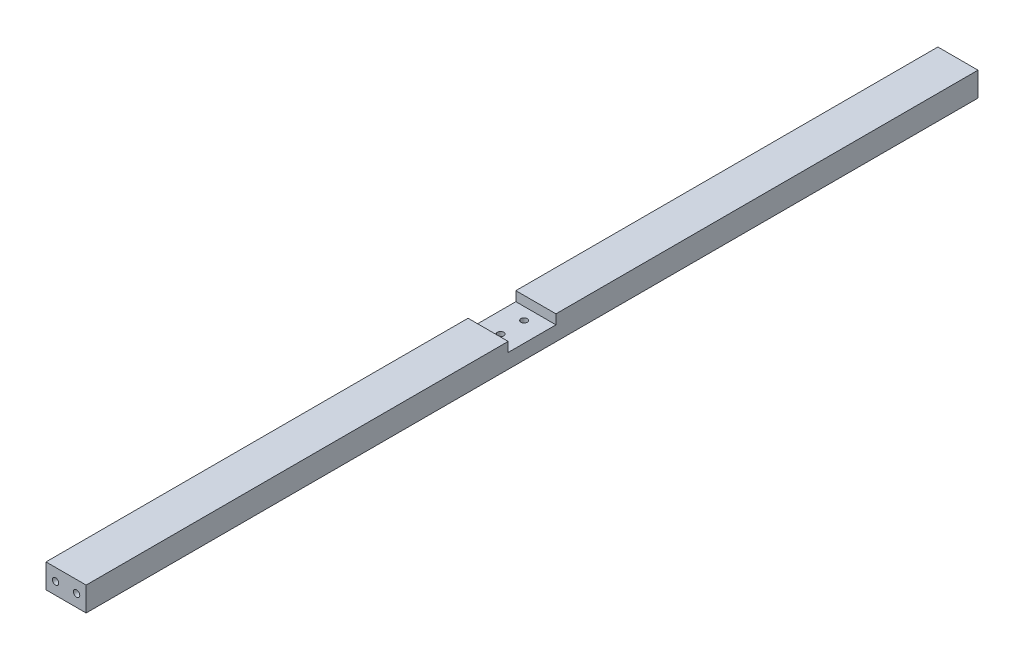
ISO-10303-21;
HEADER;
FILE_DESCRIPTION(('STEP AP214'),'2;1');
FILE_NAME('part.step','',(''),(''),'','','');
FILE_SCHEMA(('AUTOMOTIVE_DESIGN { 1 0 10303 214 1 1 1 1 }'));
ENDSEC;
DATA;
#1=APPLICATION_CONTEXT('core data for automotive mechanical design processes');
#2=APPLICATION_PROTOCOL_DEFINITION('international standard','automotive_design',2000,#1);
#3=PRODUCT_CONTEXT('',#1,'mechanical');
#4=PRODUCT('Part','Part','',(#3));
#5=PRODUCT_RELATED_PRODUCT_CATEGORY('part','',(#4));
#6=PRODUCT_DEFINITION_FORMATION('','',#4);
#7=PRODUCT_DEFINITION_CONTEXT('part definition',#1,'design');
#8=PRODUCT_DEFINITION('design','',#6,#7);
#9=PRODUCT_DEFINITION_SHAPE('','',#8);
#10=(LENGTH_UNIT() NAMED_UNIT(*) SI_UNIT(.MILLI.,.METRE.));
#11=(NAMED_UNIT(*) PLANE_ANGLE_UNIT() SI_UNIT($,.RADIAN.));
#12=(NAMED_UNIT(*) SI_UNIT($,.STERADIAN.) SOLID_ANGLE_UNIT());
#13=UNCERTAINTY_MEASURE_WITH_UNIT(LENGTH_MEASURE(1.E-05),#10,'distance_accuracy_value','');
#14=(GEOMETRIC_REPRESENTATION_CONTEXT(3) GLOBAL_UNCERTAINTY_ASSIGNED_CONTEXT((#13)) GLOBAL_UNIT_ASSIGNED_CONTEXT((#10,
#11,#12)) REPRESENTATION_CONTEXT('',''));
#15=CARTESIAN_POINT('',(0.,0.,0.));
#16=DIRECTION('',(0.,0.,1.));
#17=DIRECTION('',(1.,0.,0.));
#18=AXIS2_PLACEMENT_3D('',#15,#16,#17);
#19=CARTESIAN_POINT('',(0.,38.,1400.));
#20=DIRECTION('',(0.,-1.,0.));
#21=DIRECTION('',(0.,0.,-1.));
#22=AXIS2_PLACEMENT_3D('',#19,#20,#21);
#23=PLANE('',#22);
#24=DIRECTION('',(0.,0.,-1.));
#25=VECTOR('',#24,1.);
#26=CARTESIAN_POINT('',(0.,38.,1400.));
#27=LINE('',#26,#25);
#28=CARTESIAN_POINT('',(0.,38.,662.5));
#29=VERTEX_POINT('',#28);
#30=CARTESIAN_POINT('',(0.,38.,0.));
#31=VERTEX_POINT('',#30);
#32=EDGE_CURVE('E79',#29,#31,#27,.T.);
#33=ORIENTED_EDGE('',*,*,#32,.F.);
#34=DIRECTION('',(-1.,0.,0.));
#35=VECTOR('',#34,1.);
#36=CARTESIAN_POINT('',(0.,38.,662.5));
#37=LINE('',#36,#35);
#38=CARTESIAN_POINT('',(63.,38.,662.5));
#39=VERTEX_POINT('',#38);
#40=EDGE_CURVE('E112',#39,#29,#37,.T.);
#41=ORIENTED_EDGE('',*,*,#40,.F.);
#42=DIRECTION('',(0.,0.,-1.));
#43=VECTOR('',#42,1.);
#44=CARTESIAN_POINT('',(63.,38.,1400.));
#45=LINE('',#44,#43);
#46=CARTESIAN_POINT('',(63.,38.,0.));
#47=VERTEX_POINT('',#46);
#48=EDGE_CURVE('E182',#39,#47,#45,.T.);
#49=ORIENTED_EDGE('',*,*,#48,.T.);
#50=DIRECTION('',(-1.,0.,0.));
#51=VECTOR('',#50,1.);
#52=CARTESIAN_POINT('',(0.,38.,0.));
#53=LINE('',#52,#51);
#54=EDGE_CURVE('E168',#47,#31,#53,.T.);
#55=ORIENTED_EDGE('',*,*,#54,.T.);
#56=EDGE_LOOP('',(#33,#41,#49,#55));
#57=FACE_BOUND('',#56,.T.);
#58=ADVANCED_FACE('F33',(#57),#23,.F.);
#59=CARTESIAN_POINT('',(0.,0.,1400.));
#60=DIRECTION('',(1.,0.,0.));
#61=DIRECTION('',(0.,0.,-1.));
#62=AXIS2_PLACEMENT_3D('',#59,#60,#61);
#63=PLANE('',#62);
#64=DIRECTION('',(0.,0.,1.));
#65=VECTOR('',#64,1.);
#66=CARTESIAN_POINT('',(0.,23.,662.5));
#67=LINE('',#66,#65);
#68=CARTESIAN_POINT('',(0.,23.,662.5));
#69=VERTEX_POINT('',#68);
#70=CARTESIAN_POINT('',(0.,23.,737.5));
#71=VERTEX_POINT('',#70);
#72=EDGE_CURVE('E120',#69,#71,#67,.T.);
#73=ORIENTED_EDGE('',*,*,#72,.F.);
#74=DIRECTION('',(0.,1.,0.));
#75=VECTOR('',#74,1.);
#76=CARTESIAN_POINT('',(0.,23.,662.5));
#77=LINE('',#76,#75);
#78=EDGE_CURVE('E106',#69,#29,#77,.T.);
#79=ORIENTED_EDGE('',*,*,#78,.T.);
#80=ORIENTED_EDGE('',*,*,#32,.T.);
#81=DIRECTION('',(0.,-1.,0.));
#82=VECTOR('',#81,1.);
#83=CARTESIAN_POINT('',(0.,0.,0.));
#84=LINE('',#83,#82);
#85=CARTESIAN_POINT('',(0.,0.,0.));
#86=VERTEX_POINT('',#85);
#87=EDGE_CURVE('E163',#31,#86,#84,.T.);
#88=ORIENTED_EDGE('',*,*,#87,.T.);
#89=DIRECTION('',(0.,0.,-1.));
#90=VECTOR('',#89,1.);
#91=CARTESIAN_POINT('',(0.,0.,1400.));
#92=LINE('',#91,#90);
#93=CARTESIAN_POINT('',(0.,0.,1400.));
#94=VERTEX_POINT('',#93);
#95=EDGE_CURVE('E11',#94,#86,#92,.T.);
#96=ORIENTED_EDGE('',*,*,#95,.F.);
#97=DIRECTION('',(0.,-1.,0.));
#98=VECTOR('',#97,1.);
#99=CARTESIAN_POINT('',(0.,0.,1400.));
#100=LINE('',#99,#98);
#101=CARTESIAN_POINT('',(0.,38.,1400.));
#102=VERTEX_POINT('',#101);
#103=EDGE_CURVE('E166',#102,#94,#100,.T.);
#104=ORIENTED_EDGE('',*,*,#103,.F.);
#105=CARTESIAN_POINT('',(0.,38.,737.5));
#106=VERTEX_POINT('',#105);
#107=EDGE_CURVE('E180',#102,#106,#27,.T.);
#108=ORIENTED_EDGE('',*,*,#107,.T.);
#109=DIRECTION('',(0.,1.,0.));
#110=VECTOR('',#109,1.);
#111=CARTESIAN_POINT('',(0.,23.,737.5));
#112=LINE('',#111,#110);
#113=EDGE_CURVE('E48',#71,#106,#112,.T.);
#114=ORIENTED_EDGE('',*,*,#113,.F.);
#115=EDGE_LOOP('',(#73,#79,#80,#88,#96,#104,#108,#114));
#116=FACE_BOUND('',#115,.T.);
#117=ADVANCED_FACE('F35',(#116),#63,.F.);
#118=CARTESIAN_POINT('',(0.,0.,1400.));
#119=DIRECTION('',(0.,1.,0.));
#120=DIRECTION('',(0.,0.,1.));
#121=AXIS2_PLACEMENT_3D('',#118,#119,#120);
#122=PLANE('',#121);
#123=CARTESIAN_POINT('',(32.,0.,681.5));
#124=DIRECTION('',(0.,1.,0.));
#125=DIRECTION('',(0.,0.,-1.));
#126=AXIS2_PLACEMENT_3D('',#123,#124,#125);
#127=CIRCLE('',#126,5.);
#128=CARTESIAN_POINT('',(32.,0.,676.5));
#129=VERTEX_POINT('',#128);
#130=EDGE_CURVE('E230',#129,#129,#127,.T.);
#131=ORIENTED_EDGE('',*,*,#130,.T.);
#132=EDGE_LOOP('',(#131));
#133=FACE_BOUND('',#132,.T.);
#134=CARTESIAN_POINT('',(32.,0.,718.5));
#135=DIRECTION('',(0.,1.,0.));
#136=DIRECTION('',(0.,0.,1.));
#137=AXIS2_PLACEMENT_3D('',#134,#135,#136);
#138=CIRCLE('',#137,5.);
#139=CARTESIAN_POINT('',(32.,0.,723.5));
#140=VERTEX_POINT('',#139);
#141=EDGE_CURVE('E133',#140,#140,#138,.T.);
#142=ORIENTED_EDGE('',*,*,#141,.T.);
#143=EDGE_LOOP('',(#142));
#144=FACE_BOUND('',#143,.T.);
#145=DIRECTION('',(1.,0.,0.));
#146=VECTOR('',#145,1.);
#147=CARTESIAN_POINT('',(0.,0.,0.));
#148=LINE('',#147,#146);
#149=CARTESIAN_POINT('',(63.,0.,0.));
#150=VERTEX_POINT('',#149);
#151=EDGE_CURVE('E174',#86,#150,#148,.T.);
#152=ORIENTED_EDGE('',*,*,#151,.T.);
#153=DIRECTION('',(0.,0.,-1.));
#154=VECTOR('',#153,1.);
#155=CARTESIAN_POINT('',(63.,0.,1400.));
#156=LINE('',#155,#154);
#157=CARTESIAN_POINT('',(63.,0.,1400.));
#158=VERTEX_POINT('',#157);
#159=EDGE_CURVE('E41',#158,#150,#156,.T.);
#160=ORIENTED_EDGE('',*,*,#159,.F.);
#161=DIRECTION('',(1.,0.,0.));
#162=VECTOR('',#161,1.);
#163=CARTESIAN_POINT('',(0.,0.,1400.));
#164=LINE('',#163,#162);
#165=EDGE_CURVE('E86',#94,#158,#164,.T.);
#166=ORIENTED_EDGE('',*,*,#165,.F.);
#167=ORIENTED_EDGE('',*,*,#95,.T.);
#168=EDGE_LOOP('',(#152,#160,#166,#167));
#169=FACE_BOUND('',#168,.T.);
#170=ADVANCED_FACE('F220',(#133,#144,#169),#122,.F.);
#171=CARTESIAN_POINT('',(63.,0.,1400.));
#172=DIRECTION('',(-1.,0.,0.));
#173=DIRECTION('',(0.,0.,1.));
#174=AXIS2_PLACEMENT_3D('',#171,#172,#173);
#175=PLANE('',#174);
#176=ORIENTED_EDGE('',*,*,#48,.F.);
#177=DIRECTION('',(0.,1.,0.));
#178=VECTOR('',#177,1.);
#179=CARTESIAN_POINT('',(63.,23.,662.5));
#180=LINE('',#179,#178);
#181=CARTESIAN_POINT('',(63.,23.,662.5));
#182=VERTEX_POINT('',#181);
#183=EDGE_CURVE('E135',#182,#39,#180,.T.);
#184=ORIENTED_EDGE('',*,*,#183,.F.);
#185=DIRECTION('',(0.,0.,-1.));
#186=VECTOR('',#185,1.);
#187=CARTESIAN_POINT('',(63.,23.,737.5));
#188=LINE('',#187,#186);
#189=CARTESIAN_POINT('',(63.,23.,737.5));
#190=VERTEX_POINT('',#189);
#191=EDGE_CURVE('E114',#190,#182,#188,.T.);
#192=ORIENTED_EDGE('',*,*,#191,.F.);
#193=DIRECTION('',(0.,1.,0.));
#194=VECTOR('',#193,1.);
#195=CARTESIAN_POINT('',(63.,23.,737.5));
#196=LINE('',#195,#194);
#197=CARTESIAN_POINT('',(63.,38.,737.5));
#198=VERTEX_POINT('',#197);
#199=EDGE_CURVE('E138',#190,#198,#196,.T.);
#200=ORIENTED_EDGE('',*,*,#199,.T.);
#201=CARTESIAN_POINT('',(63.,38.,1400.));
#202=VERTEX_POINT('',#201);
#203=EDGE_CURVE('E183',#202,#198,#45,.T.);
#204=ORIENTED_EDGE('',*,*,#203,.F.);
#205=DIRECTION('',(0.,1.,0.));
#206=VECTOR('',#205,1.);
#207=CARTESIAN_POINT('',(63.,0.,1400.));
#208=LINE('',#207,#206);
#209=EDGE_CURVE('E170',#158,#202,#208,.T.);
#210=ORIENTED_EDGE('',*,*,#209,.F.);
#211=ORIENTED_EDGE('',*,*,#159,.T.);
#212=DIRECTION('',(0.,1.,0.));
#213=VECTOR('',#212,1.);
#214=CARTESIAN_POINT('',(63.,0.,0.));
#215=LINE('',#214,#213);
#216=EDGE_CURVE('E176',#150,#47,#215,.T.);
#217=ORIENTED_EDGE('',*,*,#216,.T.);
#218=EDGE_LOOP('',(#176,#184,#192,#200,#204,#210,#211,#217));
#219=FACE_BOUND('',#218,.T.);
#220=ADVANCED_FACE('F190',(#219),#175,.F.);
#221=ORIENTED_EDGE('',*,*,#203,.T.);
#222=DIRECTION('',(1.,0.,0.));
#223=VECTOR('',#222,1.);
#224=CARTESIAN_POINT('',(0.,38.,737.5));
#225=LINE('',#224,#223);
#226=EDGE_CURVE('E123',#106,#198,#225,.T.);
#227=ORIENTED_EDGE('',*,*,#226,.F.);
#228=ORIENTED_EDGE('',*,*,#107,.F.);
#229=DIRECTION('',(-1.,0.,0.));
#230=VECTOR('',#229,1.);
#231=CARTESIAN_POINT('',(0.,38.,1400.));
#232=LINE('',#231,#230);
#233=EDGE_CURVE('E57',#202,#102,#232,.T.);
#234=ORIENTED_EDGE('',*,*,#233,.F.);
#235=EDGE_LOOP('',(#221,#227,#228,#234));
#236=FACE_BOUND('',#235,.T.);
#237=ADVANCED_FACE('F198',(#236),#23,.F.);
#238=CARTESIAN_POINT('',(0.,0.,1400.));
#239=DIRECTION('',(0.,0.,-1.));
#240=DIRECTION('',(-1.,0.,0.));
#241=AXIS2_PLACEMENT_3D('',#238,#239,#240);
#242=PLANE('',#241);
#243=CARTESIAN_POINT('',(48.,19.,1400.));
#244=DIRECTION('',(0.,0.,1.));
#245=DIRECTION('',(-1.,0.,0.));
#246=AXIS2_PLACEMENT_3D('',#243,#244,#245);
#247=CIRCLE('',#246,5.);
#248=CARTESIAN_POINT('',(43.,19.,1400.));
#249=VERTEX_POINT('',#248);
#250=EDGE_CURVE('E151',#249,#249,#247,.T.);
#251=ORIENTED_EDGE('',*,*,#250,.F.);
#252=EDGE_LOOP('',(#251));
#253=FACE_BOUND('',#252,.T.);
#254=CARTESIAN_POINT('',(15.,19.,1400.));
#255=DIRECTION('',(0.,0.,1.));
#256=DIRECTION('',(1.,0.,0.));
#257=AXIS2_PLACEMENT_3D('',#254,#255,#256);
#258=CIRCLE('',#257,5.);
#259=CARTESIAN_POINT('',(20.,19.,1400.));
#260=VERTEX_POINT('',#259);
#261=EDGE_CURVE('E157',#260,#260,#258,.T.);
#262=ORIENTED_EDGE('',*,*,#261,.F.);
#263=EDGE_LOOP('',(#262));
#264=FACE_BOUND('',#263,.T.);
#265=ORIENTED_EDGE('',*,*,#103,.T.);
#266=ORIENTED_EDGE('',*,*,#165,.T.);
#267=ORIENTED_EDGE('',*,*,#209,.T.);
#268=ORIENTED_EDGE('',*,*,#233,.T.);
#269=EDGE_LOOP('',(#265,#266,#267,#268));
#270=FACE_BOUND('',#269,.T.);
#271=ADVANCED_FACE('F201',(#253,#264,#270),#242,.F.);
#272=CARTESIAN_POINT('',(0.,0.,0.));
#273=DIRECTION('',(0.,0.,-1.));
#274=DIRECTION('',(-1.,0.,0.));
#275=AXIS2_PLACEMENT_3D('',#272,#273,#274);
#276=PLANE('',#275);
#277=CARTESIAN_POINT('',(48.,19.,0.));
#278=DIRECTION('',(0.,0.,1.));
#279=DIRECTION('',(-1.,0.,0.));
#280=AXIS2_PLACEMENT_3D('',#277,#278,#279);
#281=CIRCLE('',#280,5.);
#282=CARTESIAN_POINT('',(43.,19.,0.));
#283=VERTEX_POINT('',#282);
#284=EDGE_CURVE('E137',#283,#283,#281,.T.);
#285=ORIENTED_EDGE('',*,*,#284,.T.);
#286=EDGE_LOOP('',(#285));
#287=FACE_BOUND('',#286,.T.);
#288=CARTESIAN_POINT('',(15.,19.,0.));
#289=DIRECTION('',(0.,0.,1.));
#290=DIRECTION('',(1.,0.,0.));
#291=AXIS2_PLACEMENT_3D('',#288,#289,#290);
#292=CIRCLE('',#291,5.);
#293=CARTESIAN_POINT('',(20.,19.,0.));
#294=VERTEX_POINT('',#293);
#295=EDGE_CURVE('E145',#294,#294,#292,.T.);
#296=ORIENTED_EDGE('',*,*,#295,.T.);
#297=EDGE_LOOP('',(#296));
#298=FACE_BOUND('',#297,.T.);
#299=ORIENTED_EDGE('',*,*,#87,.F.);
#300=ORIENTED_EDGE('',*,*,#54,.F.);
#301=ORIENTED_EDGE('',*,*,#216,.F.);
#302=ORIENTED_EDGE('',*,*,#151,.F.);
#303=EDGE_LOOP('',(#299,#300,#301,#302));
#304=FACE_BOUND('',#303,.T.);
#305=ADVANCED_FACE('F195',(#287,#298,#304),#276,.T.);
#306=CARTESIAN_POINT('',(15.,19.,1350.));
#307=DIRECTION('',(0.,0.,1.));
#308=DIRECTION('',(1.,0.,0.));
#309=AXIS2_PLACEMENT_3D('',#306,#307,#308);
#310=CYLINDRICAL_SURFACE('',#309,5.);
#311=CARTESIAN_POINT('',(15.,19.,1350.));
#312=DIRECTION('',(0.,0.,1.));
#313=DIRECTION('',(1.,0.,0.));
#314=AXIS2_PLACEMENT_3D('',#311,#312,#313);
#315=CIRCLE('',#314,5.);
#316=CARTESIAN_POINT('',(20.,19.,1350.));
#317=VERTEX_POINT('',#316);
#318=EDGE_CURVE('E160',#317,#317,#315,.T.);
#319=ORIENTED_EDGE('',*,*,#318,.F.);
#320=EDGE_LOOP('',(#319));
#321=FACE_BOUND('',#320,.T.);
#322=ORIENTED_EDGE('',*,*,#261,.T.);
#323=EDGE_LOOP('',(#322));
#324=FACE_BOUND('',#323,.T.);
#325=ADVANCED_FACE('F209',(#321,#324),#310,.F.);
#326=CARTESIAN_POINT('',(15.,19.,1350.));
#327=DIRECTION('',(0.,0.,1.));
#328=DIRECTION('',(1.,0.,0.));
#329=AXIS2_PLACEMENT_3D('',#326,#327,#328);
#330=PLANE('',#329);
#331=ORIENTED_EDGE('',*,*,#318,.T.);
#332=EDGE_LOOP('',(#331));
#333=FACE_BOUND('',#332,.T.);
#334=ADVANCED_FACE('F287',(#333),#330,.T.);
#335=CARTESIAN_POINT('',(48.,19.,1350.));
#336=DIRECTION('',(0.,0.,1.));
#337=DIRECTION('',(1.,0.,0.));
#338=AXIS2_PLACEMENT_3D('',#335,#336,#337);
#339=CYLINDRICAL_SURFACE('',#338,5.);
#340=CARTESIAN_POINT('',(48.,19.,1350.));
#341=DIRECTION('',(0.,0.,1.));
#342=DIRECTION('',(-1.,0.,0.));
#343=AXIS2_PLACEMENT_3D('',#340,#341,#342);
#344=CIRCLE('',#343,5.);
#345=CARTESIAN_POINT('',(43.,19.,1350.));
#346=VERTEX_POINT('',#345);
#347=EDGE_CURVE('E154',#346,#346,#344,.T.);
#348=ORIENTED_EDGE('',*,*,#347,.F.);
#349=EDGE_LOOP('',(#348));
#350=FACE_BOUND('',#349,.T.);
#351=ORIENTED_EDGE('',*,*,#250,.T.);
#352=EDGE_LOOP('',(#351));
#353=FACE_BOUND('',#352,.T.);
#354=ADVANCED_FACE('F283',(#350,#353),#339,.F.);
#355=CARTESIAN_POINT('',(48.,19.,1350.));
#356=DIRECTION('',(0.,0.,-1.));
#357=DIRECTION('',(-1.,0.,0.));
#358=AXIS2_PLACEMENT_3D('',#355,#356,#357);
#359=PLANE('',#358);
#360=ORIENTED_EDGE('',*,*,#347,.T.);
#361=EDGE_LOOP('',(#360));
#362=FACE_BOUND('',#361,.T.);
#363=ADVANCED_FACE('F279',(#362),#359,.F.);
#364=CARTESIAN_POINT('',(15.,19.,50.));
#365=DIRECTION('',(0.,0.,-1.));
#366=DIRECTION('',(-1.,0.,0.));
#367=AXIS2_PLACEMENT_3D('',#364,#365,#366);
#368=CYLINDRICAL_SURFACE('',#367,5.);
#369=CARTESIAN_POINT('',(15.,19.,50.));
#370=DIRECTION('',(0.,0.,1.));
#371=DIRECTION('',(1.,0.,0.));
#372=AXIS2_PLACEMENT_3D('',#369,#370,#371);
#373=CIRCLE('',#372,5.);
#374=CARTESIAN_POINT('',(20.,19.,50.));
#375=VERTEX_POINT('',#374);
#376=EDGE_CURVE('E148',#375,#375,#373,.T.);
#377=ORIENTED_EDGE('',*,*,#376,.T.);
#378=EDGE_LOOP('',(#377));
#379=FACE_BOUND('',#378,.T.);
#380=ORIENTED_EDGE('',*,*,#295,.F.);
#381=EDGE_LOOP('',(#380));
#382=FACE_BOUND('',#381,.T.);
#383=ADVANCED_FACE('F275',(#379,#382),#368,.F.);
#384=CARTESIAN_POINT('',(15.,19.,50.));
#385=DIRECTION('',(0.,0.,1.));
#386=DIRECTION('',(1.,0.,0.));
#387=AXIS2_PLACEMENT_3D('',#384,#385,#386);
#388=PLANE('',#387);
#389=ORIENTED_EDGE('',*,*,#376,.F.);
#390=EDGE_LOOP('',(#389));
#391=FACE_BOUND('',#390,.T.);
#392=ADVANCED_FACE('F271',(#391),#388,.F.);
#393=CARTESIAN_POINT('',(48.,19.,50.));
#394=DIRECTION('',(0.,0.,-1.));
#395=DIRECTION('',(-1.,0.,0.));
#396=AXIS2_PLACEMENT_3D('',#393,#394,#395);
#397=CYLINDRICAL_SURFACE('',#396,5.);
#398=CARTESIAN_POINT('',(48.,19.,50.));
#399=DIRECTION('',(0.,0.,1.));
#400=DIRECTION('',(-1.,0.,0.));
#401=AXIS2_PLACEMENT_3D('',#398,#399,#400);
#402=CIRCLE('',#401,5.);
#403=CARTESIAN_POINT('',(43.,19.,50.));
#404=VERTEX_POINT('',#403);
#405=EDGE_CURVE('E142',#404,#404,#402,.T.);
#406=ORIENTED_EDGE('',*,*,#405,.T.);
#407=EDGE_LOOP('',(#406));
#408=FACE_BOUND('',#407,.T.);
#409=ORIENTED_EDGE('',*,*,#284,.F.);
#410=EDGE_LOOP('',(#409));
#411=FACE_BOUND('',#410,.T.);
#412=ADVANCED_FACE('F267',(#408,#411),#397,.F.);
#413=CARTESIAN_POINT('',(48.,19.,50.));
#414=DIRECTION('',(0.,0.,-1.));
#415=DIRECTION('',(-1.,0.,0.));
#416=AXIS2_PLACEMENT_3D('',#413,#414,#415);
#417=PLANE('',#416);
#418=ORIENTED_EDGE('',*,*,#405,.F.);
#419=EDGE_LOOP('',(#418));
#420=FACE_BOUND('',#419,.T.);
#421=ADVANCED_FACE('F264',(#420),#417,.T.);
#422=CARTESIAN_POINT('',(0.,23.,662.5));
#423=DIRECTION('',(0.,0.,-1.));
#424=DIRECTION('',(-1.,0.,0.));
#425=AXIS2_PLACEMENT_3D('',#422,#423,#424);
#426=PLANE('',#425);
#427=ORIENTED_EDGE('',*,*,#40,.T.);
#428=ORIENTED_EDGE('',*,*,#78,.F.);
#429=DIRECTION('',(-1.,0.,0.));
#430=VECTOR('',#429,1.);
#431=CARTESIAN_POINT('',(0.,23.,662.5));
#432=LINE('',#431,#430);
#433=EDGE_CURVE('E109',#182,#69,#432,.T.);
#434=ORIENTED_EDGE('',*,*,#433,.F.);
#435=ORIENTED_EDGE('',*,*,#183,.T.);
#436=EDGE_LOOP('',(#427,#428,#434,#435));
#437=FACE_BOUND('',#436,.T.);
#438=ADVANCED_FACE('F108',(#437),#426,.F.);
#439=CARTESIAN_POINT('',(0.,23.,737.5));
#440=DIRECTION('',(0.,0.,1.));
#441=DIRECTION('',(1.,0.,0.));
#442=AXIS2_PLACEMENT_3D('',#439,#440,#441);
#443=PLANE('',#442);
#444=ORIENTED_EDGE('',*,*,#226,.T.);
#445=ORIENTED_EDGE('',*,*,#199,.F.);
#446=DIRECTION('',(1.,0.,0.));
#447=VECTOR('',#446,1.);
#448=CARTESIAN_POINT('',(0.,23.,737.5));
#449=LINE('',#448,#447);
#450=EDGE_CURVE('E126',#71,#190,#449,.T.);
#451=ORIENTED_EDGE('',*,*,#450,.F.);
#452=ORIENTED_EDGE('',*,*,#113,.T.);
#453=EDGE_LOOP('',(#444,#445,#451,#452));
#454=FACE_BOUND('',#453,.T.);
#455=ADVANCED_FACE('F248',(#454),#443,.F.);
#456=CARTESIAN_POINT('',(0.,23.,0.));
#457=DIRECTION('',(0.,1.,0.));
#458=DIRECTION('',(0.,0.,1.));
#459=AXIS2_PLACEMENT_3D('',#456,#457,#458);
#460=PLANE('',#459);
#461=CARTESIAN_POINT('',(32.,23.,681.5));
#462=DIRECTION('',(0.,1.,0.));
#463=DIRECTION('',(0.,0.,-1.));
#464=AXIS2_PLACEMENT_3D('',#461,#462,#463);
#465=CIRCLE('',#464,5.);
#466=CARTESIAN_POINT('',(32.,23.,676.5));
#467=VERTEX_POINT('',#466);
#468=EDGE_CURVE('E238',#467,#467,#465,.T.);
#469=ORIENTED_EDGE('',*,*,#468,.F.);
#470=EDGE_LOOP('',(#469));
#471=FACE_BOUND('',#470,.T.);
#472=CARTESIAN_POINT('',(32.,23.,718.5));
#473=DIRECTION('',(0.,1.,0.));
#474=DIRECTION('',(0.,0.,1.));
#475=AXIS2_PLACEMENT_3D('',#472,#473,#474);
#476=CIRCLE('',#475,5.);
#477=CARTESIAN_POINT('',(32.,23.,723.5));
#478=VERTEX_POINT('',#477);
#479=EDGE_CURVE('E234',#478,#478,#476,.T.);
#480=ORIENTED_EDGE('',*,*,#479,.F.);
#481=EDGE_LOOP('',(#480));
#482=FACE_BOUND('',#481,.T.);
#483=ORIENTED_EDGE('',*,*,#433,.T.);
#484=ORIENTED_EDGE('',*,*,#72,.T.);
#485=ORIENTED_EDGE('',*,*,#450,.T.);
#486=ORIENTED_EDGE('',*,*,#191,.T.);
#487=EDGE_LOOP('',(#483,#484,#485,#486));
#488=FACE_BOUND('',#487,.T.);
#489=ADVANCED_FACE('F118',(#471,#482,#488),#460,.T.);
#490=CARTESIAN_POINT('',(32.,0.,718.5));
#491=DIRECTION('',(0.,1.,0.));
#492=DIRECTION('',(0.,0.,1.));
#493=AXIS2_PLACEMENT_3D('',#490,#491,#492);
#494=CYLINDRICAL_SURFACE('',#493,5.);
#495=ORIENTED_EDGE('',*,*,#141,.F.);
#496=EDGE_LOOP('',(#495));
#497=FACE_BOUND('',#496,.T.);
#498=ORIENTED_EDGE('',*,*,#479,.T.);
#499=EDGE_LOOP('',(#498));
#500=FACE_BOUND('',#499,.T.);
#501=ADVANCED_FACE('F247',(#497,#500),#494,.F.);
#502=CARTESIAN_POINT('',(32.,0.,681.5));
#503=DIRECTION('',(0.,1.,0.));
#504=DIRECTION('',(0.,0.,1.));
#505=AXIS2_PLACEMENT_3D('',#502,#503,#504);
#506=CYLINDRICAL_SURFACE('',#505,5.);
#507=ORIENTED_EDGE('',*,*,#130,.F.);
#508=EDGE_LOOP('',(#507));
#509=FACE_BOUND('',#508,.T.);
#510=ORIENTED_EDGE('',*,*,#468,.T.);
#511=EDGE_LOOP('',(#510));
#512=FACE_BOUND('',#511,.T.);
#513=ADVANCED_FACE('F243',(#509,#512),#506,.F.);
#514=CLOSED_SHELL('',(#58,#117,#170,#220,#237,#271,#305,#325,#334,#354,#363,#383,#392,#412,#421,
#438,#455,#489,#501,#513));
#515=MANIFOLD_SOLID_BREP('B2',#514);
#516=ADVANCED_BREP_SHAPE_REPRESENTATION('',(#18,#515),#14);
#517=SHAPE_DEFINITION_REPRESENTATION(#9,#516);
ENDSEC;
END-ISO-10303-21;
